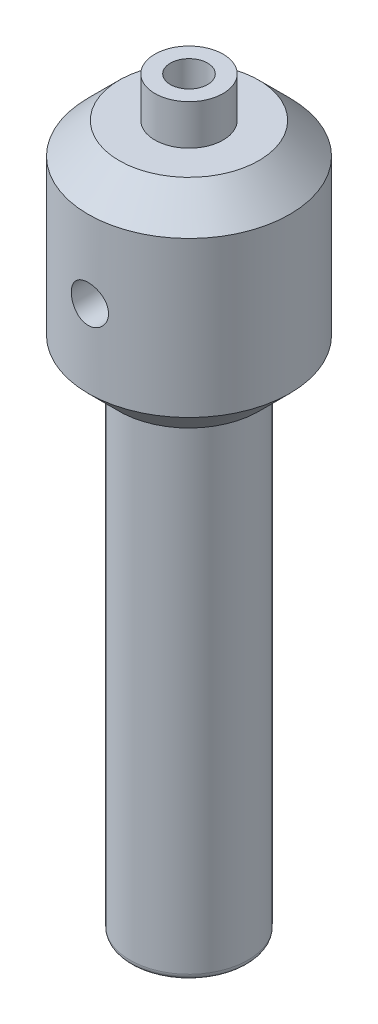
ISO-10303-21;
HEADER;
FILE_DESCRIPTION(('STEP AP214'),'2;1');
FILE_NAME('part.step','',(''),(''),'','','');
FILE_SCHEMA(('AUTOMOTIVE_DESIGN { 1 0 10303 214 1 1 1 1 }'));
ENDSEC;
DATA;
#1=APPLICATION_CONTEXT('core data for automotive mechanical design processes');
#2=APPLICATION_PROTOCOL_DEFINITION('international standard','automotive_design',2000,#1);
#3=PRODUCT_CONTEXT('',#1,'mechanical');
#4=PRODUCT('Part','Part','',(#3));
#5=PRODUCT_RELATED_PRODUCT_CATEGORY('part','',(#4));
#6=PRODUCT_DEFINITION_FORMATION('','',#4);
#7=PRODUCT_DEFINITION_CONTEXT('part definition',#1,'design');
#8=PRODUCT_DEFINITION('design','',#6,#7);
#9=PRODUCT_DEFINITION_SHAPE('','',#8);
#10=(LENGTH_UNIT() NAMED_UNIT(*) SI_UNIT(.MILLI.,.METRE.));
#11=(NAMED_UNIT(*) PLANE_ANGLE_UNIT() SI_UNIT($,.RADIAN.));
#12=(NAMED_UNIT(*) SI_UNIT($,.STERADIAN.) SOLID_ANGLE_UNIT());
#13=UNCERTAINTY_MEASURE_WITH_UNIT(LENGTH_MEASURE(1.E-05),#10,'distance_accuracy_value','');
#14=(GEOMETRIC_REPRESENTATION_CONTEXT(3) GLOBAL_UNCERTAINTY_ASSIGNED_CONTEXT((#13)) GLOBAL_UNIT_ASSIGNED_CONTEXT((#10,
#11,#12)) REPRESENTATION_CONTEXT('',''));
#15=CARTESIAN_POINT('',(0.,0.,0.));
#16=DIRECTION('',(0.,0.,1.));
#17=DIRECTION('',(1.,0.,0.));
#18=AXIS2_PLACEMENT_3D('',#15,#16,#17);
#19=CARTESIAN_POINT('',(19.,0.,0.));
#20=DIRECTION('',(0.,-1.,0.));
#21=DIRECTION('',(0.,0.,-1.));
#22=AXIS2_PLACEMENT_3D('',#19,#20,#21);
#23=PLANE('',#22);
#24=CARTESIAN_POINT('',(0.,0.,0.));
#25=DIRECTION('',(0.,-1.,0.));
#26=DIRECTION('',(0.,0.,-1.));
#27=AXIS2_PLACEMENT_3D('',#24,#25,#26);
#28=CIRCLE('',#27,17.);
#29=CARTESIAN_POINT('',(0.,0.,-17.));
#30=VERTEX_POINT('',#29);
#31=EDGE_CURVE('E68',#30,#30,#28,.T.);
#32=ORIENTED_EDGE('',*,*,#31,.T.);
#33=EDGE_LOOP('',(#32));
#34=FACE_BOUND('',#33,.T.);
#35=ADVANCED_FACE('F45',(#34),#23,.T.);
#36=CARTESIAN_POINT('',(0.,240.,0.));
#37=DIRECTION('',(0.,1.,0.));
#38=DIRECTION('',(0.,0.,1.));
#39=AXIS2_PLACEMENT_3D('',#36,#37,#38);
#40=PLANE('',#39);
#41=CARTESIAN_POINT('',(0.,240.,0.));
#42=DIRECTION('',(0.,1.,0.));
#43=DIRECTION('',(0.,0.,1.));
#44=AXIS2_PLACEMENT_3D('',#41,#42,#43);
#45=CIRCLE('',#44,6.00000000000001);
#46=CARTESIAN_POINT('',(0.,240.,6.00000000000001));
#47=VERTEX_POINT('',#46);
#48=EDGE_CURVE('E177',#47,#47,#45,.T.);
#49=ORIENTED_EDGE('',*,*,#48,.F.);
#50=EDGE_LOOP('',(#49));
#51=FACE_BOUND('',#50,.T.);
#52=CARTESIAN_POINT('',(0.,240.,0.));
#53=DIRECTION('',(0.,-1.,0.));
#54=DIRECTION('',(0.,0.,-1.));
#55=AXIS2_PLACEMENT_3D('',#52,#53,#54);
#56=CIRCLE('',#55,11.);
#57=CARTESIAN_POINT('',(0.,240.,-11.));
#58=VERTEX_POINT('',#57);
#59=EDGE_CURVE('E150',#58,#58,#56,.T.);
#60=ORIENTED_EDGE('',*,*,#59,.F.);
#61=EDGE_LOOP('',(#60));
#62=FACE_BOUND('',#61,.T.);
#63=ADVANCED_FACE('F108',(#51,#62),#40,.T.);
#64=CARTESIAN_POINT('',(0.,0.,0.));
#65=DIRECTION('',(0.,-1.,0.));
#66=DIRECTION('',(0.,0.,-1.));
#67=AXIS2_PLACEMENT_3D('',#64,#65,#66);
#68=CYLINDRICAL_SURFACE('',#67,11.);
#69=ORIENTED_EDGE('',*,*,#59,.T.);
#70=EDGE_LOOP('',(#69));
#71=FACE_BOUND('',#70,.T.);
#72=CARTESIAN_POINT('',(0.,227.,0.));
#73=DIRECTION('',(0.,-1.,0.));
#74=DIRECTION('',(0.,0.,-1.));
#75=AXIS2_PLACEMENT_3D('',#72,#73,#74);
#76=CIRCLE('',#75,11.);
#77=CARTESIAN_POINT('',(0.,227.,-11.));
#78=VERTEX_POINT('',#77);
#79=EDGE_CURVE('E162',#78,#78,#76,.T.);
#80=ORIENTED_EDGE('',*,*,#79,.F.);
#81=EDGE_LOOP('',(#80));
#82=FACE_BOUND('',#81,.T.);
#83=ADVANCED_FACE('F115',(#71,#82),#68,.T.);
#84=CARTESIAN_POINT('',(11.,227.,0.));
#85=DIRECTION('',(0.,1.,0.));
#86=DIRECTION('',(0.,0.,1.));
#87=AXIS2_PLACEMENT_3D('',#84,#85,#86);
#88=PLANE('',#87);
#89=CARTESIAN_POINT('',(0.,227.,0.));
#90=DIRECTION('',(0.,1.,0.));
#91=DIRECTION('',(0.,0.,1.));
#92=AXIS2_PLACEMENT_3D('',#89,#90,#91);
#93=CIRCLE('',#92,22.5);
#94=CARTESIAN_POINT('',(0.,227.,22.5));
#95=VERTEX_POINT('',#94);
#96=EDGE_CURVE('E137',#95,#95,#93,.T.);
#97=ORIENTED_EDGE('',*,*,#96,.T.);
#98=EDGE_LOOP('',(#97));
#99=FACE_BOUND('',#98,.T.);
#100=ORIENTED_EDGE('',*,*,#79,.T.);
#101=EDGE_LOOP('',(#100));
#102=FACE_BOUND('',#101,.T.);
#103=ADVANCED_FACE('F103',(#99,#102),#88,.T.);
#104=CARTESIAN_POINT('',(0.,0.,0.));
#105=DIRECTION('',(0.,-1.,0.));
#106=DIRECTION('',(0.,0.,-1.));
#107=AXIS2_PLACEMENT_3D('',#104,#105,#106);
#108=CYLINDRICAL_SURFACE('',#107,32.5);
#109=CARTESIAN_POINT('',(0.,198.,-32.5));
#110=CARTESIAN_POINT('',(0.167047387974413,198.000002951048,-32.5000014014323));
#111=CARTESIAN_POINT('',(0.334056414535263,197.993021813711,-32.498709777994));
#112=CARTESIAN_POINT('',(0.666922031200574,197.965157067144,-32.4935823968578));
#113=CARTESIAN_POINT('',(0.832778404858177,197.944270914476,-32.4897461737147));
#114=CARTESIAN_POINT('',(1.16218709311424,197.888738536972,-32.4796320956752));
#115=CARTESIAN_POINT('',(1.32573803450884,197.854084442608,-32.4733528444273));
#116=CARTESIAN_POINT('',(1.64934345668916,197.771271041131,-32.4585259988948));
#117=CARTESIAN_POINT('',(1.80939663010089,197.72310677428,-32.449977571632));
#118=CARTESIAN_POINT('',(2.12461909376536,197.613714664144,-32.4308633624607));
#119=CARTESIAN_POINT('',(2.27979434281073,197.552503531732,-32.4203001629443));
#120=CARTESIAN_POINT('',(2.58446206954015,197.417410303793,-32.3974366809218));
#121=CARTESIAN_POINT('',(2.73395242740515,197.34352353721,-32.3851357583491));
#122=CARTESIAN_POINT('',(3.0261060502108,197.1836663224,-32.3591437290318));
#123=CARTESIAN_POINT('',(3.16877249289801,197.097701573525,-32.3454532788177));
#124=CARTESIAN_POINT('',(3.44644953798865,196.914233178875,-32.3170461894859));
#125=CARTESIAN_POINT('',(3.5814572600222,196.816725233819,-32.302329168864));
#126=CARTESIAN_POINT('',(3.84417623264325,196.609831402662,-32.2721237443791));
#127=CARTESIAN_POINT('',(3.97180053780937,196.500336011848,-32.2566290755317));
#128=CARTESIAN_POINT('',(4.21744501771728,196.27099554245,-32.2254324395731));
#129=CARTESIAN_POINT('',(4.33546161754137,196.151146645324,-32.2097303978036));
#130=CARTESIAN_POINT('',(4.56100087376238,195.901986604755,-32.1785678807606));
#131=CARTESIAN_POINT('',(4.66852662807659,195.772678274512,-32.1631073353135));
#132=CARTESIAN_POINT('',(4.87241936155105,195.505394933914,-32.1328517105622));
#133=CARTESIAN_POINT('',(4.96878221059232,195.36741674477,-32.1180568787931));
#134=CARTESIAN_POINT('',(5.15028638072952,195.082734596099,-32.0894539852933));
#135=CARTESIAN_POINT('',(5.23534055334005,194.935974240216,-32.075653924559));
#136=CARTESIAN_POINT('',(5.39279796033513,194.635620840363,-32.0495569658406));
#137=CARTESIAN_POINT('',(5.46519645843932,194.482025265232,-32.0372606311283));
#138=CARTESIAN_POINT('',(5.59673049546194,194.169186629211,-32.0145447471987));
#139=CARTESIAN_POINT('',(5.65587180506682,194.00994606061,-32.004124381786));
#140=CARTESIAN_POINT('',(5.76049139817701,193.68689735635,-31.9854579827381));
#141=CARTESIAN_POINT('',(5.80596470935164,193.523087582069,-31.9772127405319));
#142=CARTESIAN_POINT('',(5.92036897645239,193.030409159429,-31.9563064605375));
#143=CARTESIAN_POINT('',(5.96891901071691,192.696386732529,-31.9471824578801));
#144=CARTESIAN_POINT('',(6.0093777303918,192.025005778692,-31.9395955731684));
#145=CARTESIAN_POINT('',(6.00129133836947,191.687647544233,-31.9411317645811));
#146=CARTESIAN_POINT('',(5.92929348899846,191.023490395548,-31.954573465592));
#147=CARTESIAN_POINT('',(5.86609521960248,190.696611688162,-31.9663464973695));
#148=CARTESIAN_POINT('',(5.68676990030916,190.058190702375,-31.9987323168554));
#149=CARTESIAN_POINT('',(5.57064066366295,189.746649058187,-32.0193454697756));
#150=CARTESIAN_POINT('',(5.28805391152012,189.145635615852,-32.0672268492818));
#151=CARTESIAN_POINT('',(5.12130716064853,188.856302952439,-32.0945331440214));
#152=CARTESIAN_POINT('',(4.74242193954202,188.30945617947,-32.1526990787034));
#153=CARTESIAN_POINT('',(4.53027899873099,188.051945207629,-32.1835590684723));
#154=CARTESIAN_POINT('',(4.0627715303044,187.571927527527,-32.2459333357088));
#155=CARTESIAN_POINT('',(3.80679653324243,187.350015311049,-32.2774504088927));
#156=CARTESIAN_POINT('',(3.26093695329239,186.952194045544,-32.3371543132372));
#157=CARTESIAN_POINT('',(2.97105204985807,186.776285431433,-32.3653411129122));
#158=CARTESIAN_POINT('',(2.36499021324981,186.475381996096,-32.4152628733546));
#159=CARTESIAN_POINT('',(2.04878258243285,186.350447651793,-32.4369901621846));
#160=CARTESIAN_POINT('',(1.39937919492224,186.155633070481,-32.4714852504939));
#161=CARTESIAN_POINT('',(1.06618519067571,186.085747166433,-32.4842539722107));
#162=CARTESIAN_POINT('',(0.397383215203499,186.003837604151,-32.4992669465579));
#163=CARTESIAN_POINT('',(0.0618782483745508,185.990999171889,-32.5016593853383));
#164=CARTESIAN_POINT('',(-0.606484909661271,186.021365382145,-32.4960590637379));
#165=CARTESIAN_POINT('',(-0.939343226021675,186.064567358601,-32.4880667973981));
#166=CARTESIAN_POINT('',(-1.59038992422883,186.205110554301,-32.4626872786007));
#167=CARTESIAN_POINT('',(-1.90867005010831,186.302040788101,-32.4453713741909));
#168=CARTESIAN_POINT('',(-2.52446187534885,186.546845306371,-32.4032781211012));
#169=CARTESIAN_POINT('',(-2.82197219688196,186.694722966739,-32.3785002779893));
#170=CARTESIAN_POINT('',(-3.39126548533968,187.039036730946,-32.3238620342217));
#171=CARTESIAN_POINT('',(-3.66274135122634,187.235972303467,-32.2939504055836));
#172=CARTESIAN_POINT('',(-4.16908432952836,187.672135346245,-32.2324977111764));
#173=CARTESIAN_POINT('',(-4.40394813141742,187.911366636785,-32.2009564984004));
#174=CARTESIAN_POINT('',(-4.83348551479758,188.429009489889,-32.1393095123828));
#175=CARTESIAN_POINT('',(-5.02760384169284,188.707885037177,-32.1092273941104));
#176=CARTESIAN_POINT('',(-5.3662384165949,189.29477862801,-32.0543763326783));
#177=CARTESIAN_POINT('',(-5.51075647264598,189.602795608759,-32.0296071958605));
#178=CARTESIAN_POINT('',(-5.74529998594316,190.237733868761,-31.9883683472532));
#179=CARTESIAN_POINT('',(-5.83558308225324,190.564557555855,-31.9718594593372));
#180=CARTESIAN_POINT('',(-5.9598710985257,191.229255527096,-31.948929495688));
#181=CARTESIAN_POINT('',(-5.9938821523063,191.567128602734,-31.9425073204774));
#182=CARTESIAN_POINT('',(-6.00189486714629,192.071678138939,-31.9409937887346));
#183=CARTESIAN_POINT('',(-5.99758283494899,192.238274119685,-31.9418077558083));
#184=CARTESIAN_POINT('',(-5.97513253775216,192.570482113081,-31.9460164877228));
#185=CARTESIAN_POINT('',(-5.95699949373229,192.736094473498,-31.949410278017));
#186=CARTESIAN_POINT('',(-5.9070336299794,193.065215620486,-31.9586855963114));
#187=CARTESIAN_POINT('',(-5.87519596756223,193.228723642411,-31.9645680036804));
#188=CARTESIAN_POINT('',(-5.79808429743152,193.552378272652,-31.9786453020169));
#189=CARTESIAN_POINT('',(-5.75281510317849,193.712526063197,-31.9868393645045));
#190=CARTESIAN_POINT('',(-5.6492524053349,194.028176622226,-32.00529184354));
#191=CARTESIAN_POINT('',(-5.59097742811479,194.183685644782,-32.0155473216154));
#192=CARTESIAN_POINT('',(-5.46182056358106,194.489178204963,-32.037833983043));
#193=CARTESIAN_POINT('',(-5.39094316290595,194.63916368618,-32.049864534186));
#194=CARTESIAN_POINT('',(-5.23704527717771,194.932717658784,-32.0753712303171));
#195=CARTESIAN_POINT('',(-5.154019883669,195.076283525534,-32.0888479590507));
#196=CARTESIAN_POINT('',(-4.97646002457541,195.35593046589,-32.1168634444832));
#197=CARTESIAN_POINT('',(-4.88192955508218,195.492014114611,-32.1314018317353));
#198=CARTESIAN_POINT('',(-4.68049098336986,195.757821711608,-32.1613669342853));
#199=CARTESIAN_POINT('',(-4.5734194828492,195.887420733857,-32.1768036560178));
#200=CARTESIAN_POINT('',(-4.34884138360292,196.137120438952,-32.2079248208257));
#201=CARTESIAN_POINT('',(-4.23133849380697,196.257224469299,-32.2236091742366));
#202=CARTESIAN_POINT('',(-3.98659111868759,196.487238515557,-32.2548029719053));
#203=CARTESIAN_POINT('',(-3.85934088957489,196.597142435201,-32.2703123067585));
#204=CARTESIAN_POINT('',(-3.59607102507716,196.805880120683,-32.3007093143118));
#205=CARTESIAN_POINT('',(-3.46005463969105,196.904717952427,-32.3155972140706));
#206=CARTESIAN_POINT('',(-3.17885786431139,197.091523494682,-32.3444742543554));
#207=CARTESIAN_POINT('',(-3.03360543194255,197.179384266206,-32.3584539984353));
#208=CARTESIAN_POINT('',(-2.73613292684859,197.342503362624,-32.3849635764459));
#209=CARTESIAN_POINT('',(-2.58391544613778,197.417766327943,-32.3974939437295));
#210=CARTESIAN_POINT('',(-2.27362825228651,197.555121589046,-32.4207463085122));
#211=CARTESIAN_POINT('',(-2.11556241225016,197.617222424426,-32.4314694775915));
#212=CARTESIAN_POINT('',(-1.7946722831985,197.727823393983,-32.4508090321666));
#213=CARTESIAN_POINT('',(-1.63184896912176,197.776326293468,-32.4594258459697));
#214=CARTESIAN_POINT('',(-1.22783758338942,197.878204607649,-32.4776798969894));
#215=CARTESIAN_POINT('',(-0.98458873619416,197.923819554013,-32.4860086220748));
#216=CARTESIAN_POINT('',(-0.49419856019614,197.984714702236,-32.4971675709575));
#217=CARTESIAN_POINT('',(-0.247057325390453,197.999995635502,-32.4999979273299));
#218=CARTESIAN_POINT('',(0.,198.,-32.5));
#219=B_SPLINE_CURVE_WITH_KNOTS('',3,(#109,#110,#111,#112,#113,#114,#115,#116,#117,#118,#119,
#120,#121,#122,#123,#124,#125,#126,#127,#128,#129,#130,#131,#132,#133,#134,#135,#136,#137,#138,
#139,#140,#141,#142,#143,#144,#145,#146,#147,#148,#149,#150,#151,#152,#153,#154,#155,#156,#157,
#158,#159,#160,#161,#162,#163,#164,#165,#166,#167,#168,#169,#170,#171,#172,#173,#174,#175,#176,
#177,#178,#179,#180,#181,#182,#183,#184,#185,#186,#187,#188,#189,#190,#191,#192,#193,#194,#195,
#196,#197,#198,#199,#200,#201,#202,#203,#204,#205,#206,#207,#208,#209,#210,#211,#212,#213,#214,
#215,#216,#217,#218),.UNSPECIFIED.,.T.,.F.,(4,2,2,2,2,2,2,2,2,2,2,2,2,2,2,2,2,2,2,2,2,2,2,2,2,2,
2,2,2,2,2,2,2,2,2,2,2,2,2,2,2,2,2,2,2,2,2,2,2,2,2,2,2,2,4),(0.,0.500925415856104,
1.00194248373588,1.50324633759921,2.00473446721871,2.50558409263794,3.00661868254916,
3.5074176336936,4.00840369848706,4.51442366052908,5.0206310543591,5.52668851124021,
6.03293260831374,6.54287614170782,7.05301011052265,7.56292159140477,8.07301835093452,
9.08064758459464,10.088189241028,11.0828828743722,12.0776176054417,13.0781469402784,
14.0787748517292,15.0946807664379,16.1105962851585,17.1277136264852,18.144726245551,
19.147165819545,20.1495577053301,21.1443857119725,22.1392796509597,23.1447493595254,
24.1503099317355,25.1687925873859,26.1872381130497,27.2008065243771,28.2142644464847,
28.7137382676778,29.2130235027488,29.7124853110036,30.2117683427893,30.7103446486533,
31.2087438085096,31.7073449079496,32.2057733184101,32.711626137455,33.2172998130326,
33.7232737924587,34.2290612523622,34.7394448349454,35.2496400010553,35.7595031320703,
36.2692625008281,37.0101317779487,37.7509831912043),.UNSPECIFIED.);
#220=CARTESIAN_POINT('',(0.,198.,-32.5));
#221=VERTEX_POINT('',#220);
#222=EDGE_CURVE('E10',#221,#221,#219,.T.);
#223=ORIENTED_EDGE('',*,*,#222,.F.);
#224=EDGE_LOOP('',(#223));
#225=FACE_BOUND('',#224,.T.);
#226=CARTESIAN_POINT('',(6.,192.,31.9413525073689));
#227=CARTESIAN_POINT('',(6.00000295853529,192.16702010578,31.9413510155267));
#228=CARTESIAN_POINT('',(5.99302407715925,192.334001842829,31.9426650102768));
#229=CARTESIAN_POINT('',(5.96516856930218,192.666812138617,31.9478791151134));
#230=CARTESIAN_POINT('',(5.94428939706713,192.832640480497,31.9517796989175));
#231=CARTESIAN_POINT('',(5.88877610738075,193.161992514205,31.9620573065449));
#232=CARTESIAN_POINT('',(5.85413407949498,193.325514824534,31.9684357545158));
#233=CARTESIAN_POINT('',(5.77135045100129,193.649062361184,31.9834845406126));
#234=CARTESIAN_POINT('',(5.72320388723112,193.80908627843,31.9921557212921));
#235=CARTESIAN_POINT('',(5.61385452206621,194.124246490147,32.0115246934934));
#236=CARTESIAN_POINT('',(5.55266878540924,194.279388871567,32.0222198341717));
#237=CARTESIAN_POINT('',(5.41763251250718,194.583993638257,32.0453420785026));
#238=CARTESIAN_POINT('',(5.34377730623473,194.733453904166,32.0577698204827));
#239=CARTESIAN_POINT('',(5.18398806674358,195.025552629714,32.0839962627161));
#240=CARTESIAN_POINT('',(5.09805970034272,195.168194247985,32.0977943188948));
#241=CARTESIAN_POINT('',(4.91466745622354,195.445828347411,32.1263856672193));
#242=CARTESIAN_POINT('',(4.81719927981947,195.580817950254,32.1411793293462));
#243=CARTESIAN_POINT('',(4.61034548396164,195.843560996205,32.1715052735179));
#244=CARTESIAN_POINT('',(4.5008459742891,195.971224083592,32.1870436584928));
#245=CARTESIAN_POINT('',(4.27148905640614,196.216946537089,32.2182832804323));
#246=CARTESIAN_POINT('',(4.15162782612187,196.335002327964,32.2339845755935));
#247=CARTESIAN_POINT('',(3.90243530466569,196.560618341113,32.2651012097673));
#248=CARTESIAN_POINT('',(3.77310687922168,196.668181716642,32.2805166335572));
#249=CARTESIAN_POINT('',(3.50577559302649,196.872146891922,32.3106427456993));
#250=CARTESIAN_POINT('',(3.36776955266252,196.968544563181,32.3253531722094));
#251=CARTESIAN_POINT('',(3.08306471017446,197.150088678451,32.3537527138723));
#252=CARTESIAN_POINT('',(2.93631162303767,197.235151271087,32.3674339230622));
#253=CARTESIAN_POINT('',(2.63597199364874,197.39262626248,32.3932768150281));
#254=CARTESIAN_POINT('',(2.4823829201994,197.465033925708,32.405437928495));
#255=CARTESIAN_POINT('',(2.16955749285646,197.596586679502,32.4278825976848));
#256=CARTESIAN_POINT('',(2.0103236129902,197.655737499093,32.4381669640968));
#257=CARTESIAN_POINT('',(1.68728985940888,197.760376316327,32.4565759252546));
#258=CARTESIAN_POINT('',(1.52348834648178,197.805859338139,32.4646997333147));
#259=CARTESIAN_POINT('',(1.0308533158068,197.920290031532,32.4852880303492));
#260=CARTESIAN_POINT('',(0.696870045496291,197.96886042554,32.4942588120656));
#261=CARTESIAN_POINT('',(0.0255664198837345,198.009373397857,32.5017263371873));
#262=CARTESIAN_POINT('',(-0.311753657266851,198.001320657124,32.5002239463955));
#263=CARTESIAN_POINT('',(-0.976054278284204,197.929377926863,32.4870176310848));
#264=CARTESIAN_POINT('',(-1.30311063675732,197.866167164928,32.4754378068713));
#265=CARTESIAN_POINT('',(-1.94188038235149,197.686755984159,32.4435119174271));
#266=CARTESIAN_POINT('',(-2.25359322258673,197.570553678071,32.4231655399838));
#267=CARTESIAN_POINT('',(-2.85482127182886,197.287811975478,32.3757858792464));
#268=CARTESIAN_POINT('',(-3.14420524520471,197.12099977746,32.3487165042421));
#269=CARTESIAN_POINT('',(-3.69112726413706,196.741972872398,32.2908861364092));
#270=CARTESIAN_POINT('',(-3.94866216241414,196.529753683949,32.2601247793352));
#271=CARTESIAN_POINT('',(-4.42860067861483,196.062189714966,32.1977799600072));
#272=CARTESIAN_POINT('',(-4.65042497033574,195.806250600413,32.1661910748591));
#273=CARTESIAN_POINT('',(-5.04808559706014,195.260494957064,32.1061894073334));
#274=CARTESIAN_POINT('',(-5.22392129912474,194.970677962086,32.077776668672));
#275=CARTESIAN_POINT('',(-5.52477115699434,194.364639341077,32.0273370970672));
#276=CARTESIAN_POINT('',(-5.64970322536738,194.048376049523,32.0053205950001));
#277=CARTESIAN_POINT('',(-5.84449643174312,193.398850988088,31.9703261346543));
#278=CARTESIAN_POINT('',(-5.9143636046489,193.065591085235,31.9573471859124));
#279=CARTESIAN_POINT('',(-5.99620229168364,192.396751015839,31.9420927158331));
#280=CARTESIAN_POINT('',(-6.00900518397556,192.061275977497,31.9396635072359));
#281=CARTESIAN_POINT('',(-5.97857858316261,191.392981018201,31.9453725765504));
#282=CARTESIAN_POINT('',(-5.93535177193745,191.060160970932,31.9535103486703));
#283=CARTESIAN_POINT('',(-5.79480586142508,190.409343291511,31.979293465026));
#284=CARTESIAN_POINT('',(-5.69792075735498,190.091248642484,31.9968624934417));
#285=CARTESIAN_POINT('',(-5.45326809850267,189.475807966959,32.0394630353324));
#286=CARTESIAN_POINT('',(-5.30549689375587,189.178463430668,32.0644950840986));
#287=CARTESIAN_POINT('',(-4.96134651750513,188.609295414165,32.1195522144905));
#288=CARTESIAN_POINT('',(-4.76444105467972,188.337795366043,32.1496301190139));
#289=CARTESIAN_POINT('',(-4.32832188526401,187.831389726128,32.2112404635557));
#290=CARTESIAN_POINT('',(-4.08910449593802,187.596487323062,32.2427730300079));
#291=CARTESIAN_POINT('',(-3.57144762775753,187.166848798412,32.3042327039952));
#292=CARTESIAN_POINT('',(-3.29254111714155,186.972671136173,32.3341337897011));
#293=CARTESIAN_POINT('',(-2.70556807005943,186.633932586305,32.3885259688708));
#294=CARTESIAN_POINT('',(-2.39750263248844,186.489369829818,32.4130172660943));
#295=CARTESIAN_POINT('',(-1.7625807268193,186.254800177585,32.453720812997));
#296=CARTESIAN_POINT('',(-1.43582908021701,186.164516450471,32.4699750052543));
#297=CARTESIAN_POINT('',(-0.771284675971643,186.040202759824,32.4925422562138));
#298=CARTESIAN_POINT('',(-0.433493046619092,186.00616706594,32.4988563275773));
#299=CARTESIAN_POINT('',(0.0710321096354791,185.998095984879,32.5003540565631));
#300=CARTESIAN_POINT('',(0.237682638844517,186.002392189745,32.499557269084));
#301=CARTESIAN_POINT('',(0.570001473574026,186.024820064111,32.495424432952));
#302=CARTESIAN_POINT('',(0.735670126050057,186.042946511486,32.4920893427311));
#303=CARTESIAN_POINT('',(1.06490505616126,186.092908806817,32.4829668638015));
#304=CARTESIAN_POINT('',(1.22847057559065,186.124749463685,32.4771786148997));
#305=CARTESIAN_POINT('',(1.55224085017753,186.201877246057,32.4633144843585));
#306=CARTESIAN_POINT('',(1.71244678909536,186.247159547125,32.4552394235426));
#307=CARTESIAN_POINT('',(2.02822736208988,186.350763583394,32.4370355937856));
#308=CARTESIAN_POINT('',(2.18380784113108,186.409067993915,32.4269095551274));
#309=CARTESIAN_POINT('',(2.48943892302124,186.538295909441,32.4048786716608));
#310=CARTESIAN_POINT('',(2.63949147339193,186.609214917922,32.3929744609303));
#311=CARTESIAN_POINT('',(2.9331721059094,186.763206776707,32.3677035827214));
#312=CARTESIAN_POINT('',(3.07679757825834,186.846284506776,32.3543363286126));
#313=CARTESIAN_POINT('',(3.35655401432149,187.02395797939,32.326510815552));
#314=CARTESIAN_POINT('',(3.49268756010242,187.118549717111,32.3120529366048));
#315=CARTESIAN_POINT('',(3.75850222746005,187.32005643899,32.2822211930687));
#316=CARTESIAN_POINT('',(3.88806348648543,187.427128074562,32.2668371982911));
#317=CARTESIAN_POINT('',(4.13768673508277,187.651698606635,32.2357777361536));
#318=CARTESIAN_POINT('',(4.2577520724429,187.769193797036,32.2201023739441));
#319=CARTESIAN_POINT('',(4.48768949162613,188.013917992755,32.188881874074));
#320=CARTESIAN_POINT('',(4.59755543208625,188.141152779532,32.1733368199345));
#321=CARTESIAN_POINT('',(4.8062192058397,188.40438395591,32.1428277311297));
#322=CARTESIAN_POINT('',(4.9050210981696,188.540377103324,32.1278634847102));
#323=CARTESIAN_POINT('',(5.09178042683273,188.821553772614,32.0987973355248));
#324=CARTESIAN_POINT('',(5.1796281571812,188.966811164144,32.084704774444));
#325=CARTESIAN_POINT('',(5.34272083193665,189.264291908901,32.0579500798171));
#326=CARTESIAN_POINT('',(5.4179704171096,189.416512670611,32.0452874201016));
#327=CARTESIAN_POINT('',(5.55529909721155,189.726805727056,32.0217661734497));
#328=CARTESIAN_POINT('',(5.61738677931814,189.884874127068,32.010906411264));
#329=CARTESIAN_POINT('',(5.72796202752485,190.205770370251,31.9913049603575));
#330=CARTESIAN_POINT('',(5.7764523672906,190.36859723527,31.9825628397174));
#331=CARTESIAN_POINT('',(5.87827970156251,190.772538416944,31.964037017176));
#332=CARTESIAN_POINT('',(5.92386631533029,191.015711803916,31.9555746068072));
#333=CARTESIAN_POINT('',(5.9847238866214,191.505951494842,31.9442335268558));
#334=CARTESIAN_POINT('',(5.99999562504256,191.753017698353,31.9413547134423));
#335=CARTESIAN_POINT('',(6.,192.,31.9413525073689));
#336=B_SPLINE_CURVE_WITH_KNOTS('',3,(#226,#227,#228,#229,#230,#231,#232,#233,#234,#235,#236,
#237,#238,#239,#240,#241,#242,#243,#244,#245,#246,#247,#248,#249,#250,#251,#252,#253,#254,#255,
#256,#257,#258,#259,#260,#261,#262,#263,#264,#265,#266,#267,#268,#269,#270,#271,#272,#273,#274,
#275,#276,#277,#278,#279,#280,#281,#282,#283,#284,#285,#286,#287,#288,#289,#290,#291,#292,#293,
#294,#295,#296,#297,#298,#299,#300,#301,#302,#303,#304,#305,#306,#307,#308,#309,#310,#311,#312,
#313,#314,#315,#316,#317,#318,#319,#320,#321,#322,#323,#324,#325,#326,#327,#328,#329,#330,#331,
#332,#333,#334,#335),.UNSPECIFIED.,.T.,.F.,(4,2,2,2,2,2,2,2,2,2,2,2,2,2,2,2,2,2,2,2,2,2,2,2,2,2,
2,2,2,2,2,2,2,2,2,2,2,2,2,2,2,2,2,2,2,2,2,2,2,2,2,2,2,2,4),(0.,0.500843463331355,
1.00177867835027,1.50300223188229,2.00441023608585,2.50516601956038,3.00610678220385,
3.50681319732148,4.00770672054381,4.51383441416539,5.02014960364327,5.52631215984353,
6.03266127501115,6.54256967053901,7.05266846938638,7.56254639910265,8.07260972824404,
9.08012563787736,10.087558258518,11.082757472296,12.0779921321037,13.0786896815496,
14.0794860395937,15.0951637423725,16.1108554231421,17.128178591491,18.1453902495802,
19.1477325069965,20.1500267887514,21.144330335666,22.1387052169704,23.1442262843942,
24.1498349132333,25.1684425209453,26.1870117562707,27.2003410634462,28.2135671298398,
28.7132031034217,29.2126505140953,29.7122731996682,30.2117167784932,30.7104998117236,
31.2091054067347,31.7079116630686,32.2065449168668,32.7122968113089,33.217869600612,
33.7237448623406,34.2294339227625,34.7398381371698,35.2500539188164,35.7599357905254,
36.269713577754,37.010358887058,37.7509851174175),.UNSPECIFIED.);
#337=CARTESIAN_POINT('',(6.,192.,31.9413525073689));
#338=VERTEX_POINT('',#337);
#339=EDGE_CURVE('E58',#338,#338,#336,.T.);
#340=ORIENTED_EDGE('',*,*,#339,.F.);
#341=EDGE_LOOP('',(#340));
#342=FACE_BOUND('',#341,.T.);
#343=CARTESIAN_POINT('',(0.,167.,0.));
#344=DIRECTION('',(0.,-1.,0.));
#345=DIRECTION('',(0.,0.,-1.));
#346=AXIS2_PLACEMENT_3D('',#343,#344,#345);
#347=CIRCLE('',#346,32.5);
#348=CARTESIAN_POINT('',(0.,167.,-32.5));
#349=VERTEX_POINT('',#348);
#350=EDGE_CURVE('E143',#349,#349,#347,.F.);
#351=ORIENTED_EDGE('',*,*,#350,.T.);
#352=EDGE_LOOP('',(#351));
#353=FACE_BOUND('',#352,.T.);
#354=CARTESIAN_POINT('',(0.,217.,0.));
#355=DIRECTION('',(0.,1.,0.));
#356=DIRECTION('',(0.,0.,1.));
#357=AXIS2_PLACEMENT_3D('',#354,#355,#356);
#358=CIRCLE('',#357,32.5);
#359=CARTESIAN_POINT('',(0.,217.,32.5));
#360=VERTEX_POINT('',#359);
#361=EDGE_CURVE('E140',#360,#360,#358,.F.);
#362=ORIENTED_EDGE('',*,*,#361,.T.);
#363=EDGE_LOOP('',(#362));
#364=FACE_BOUND('',#363,.T.);
#365=ADVANCED_FACE('F74',(#225,#342,#353,#364),#108,.T.);
#366=CARTESIAN_POINT('',(32.5,157.,0.));
#367=DIRECTION('',(0.,-1.,0.));
#368=DIRECTION('',(0.,0.,-1.));
#369=AXIS2_PLACEMENT_3D('',#366,#367,#368);
#370=PLANE('',#369);
#371=CARTESIAN_POINT('',(0.,157.,0.));
#372=DIRECTION('',(0.,-1.,0.));
#373=DIRECTION('',(0.,0.,-1.));
#374=AXIS2_PLACEMENT_3D('',#371,#372,#373);
#375=CIRCLE('',#374,22.5);
#376=CARTESIAN_POINT('',(0.,157.,-22.5));
#377=VERTEX_POINT('',#376);
#378=EDGE_CURVE('E144',#377,#377,#375,.T.);
#379=ORIENTED_EDGE('',*,*,#378,.T.);
#380=EDGE_LOOP('',(#379));
#381=FACE_BOUND('',#380,.T.);
#382=CARTESIAN_POINT('',(0.,157.,0.));
#383=DIRECTION('',(0.,-1.,0.));
#384=DIRECTION('',(0.,0.,-1.));
#385=AXIS2_PLACEMENT_3D('',#382,#383,#384);
#386=CIRCLE('',#385,19.);
#387=CARTESIAN_POINT('',(0.,157.,-19.));
#388=VERTEX_POINT('',#387);
#389=EDGE_CURVE('E165',#388,#388,#386,.T.);
#390=ORIENTED_EDGE('',*,*,#389,.F.);
#391=EDGE_LOOP('',(#390));
#392=FACE_BOUND('',#391,.T.);
#393=ADVANCED_FACE('F94',(#381,#392),#370,.T.);
#394=CARTESIAN_POINT('',(0.,0.,0.));
#395=DIRECTION('',(0.,-1.,0.));
#396=DIRECTION('',(0.,0.,-1.));
#397=AXIS2_PLACEMENT_3D('',#394,#395,#396);
#398=CYLINDRICAL_SURFACE('',#397,19.);
#399=CARTESIAN_POINT('',(0.,2.,0.));
#400=DIRECTION('',(0.,-1.,0.));
#401=DIRECTION('',(0.,0.,-1.));
#402=AXIS2_PLACEMENT_3D('',#399,#400,#401);
#403=CIRCLE('',#402,19.);
#404=CARTESIAN_POINT('',(0.,2.,-19.));
#405=VERTEX_POINT('',#404);
#406=EDGE_CURVE('E63',#405,#405,#403,.F.);
#407=ORIENTED_EDGE('',*,*,#406,.T.);
#408=EDGE_LOOP('',(#407));
#409=FACE_BOUND('',#408,.T.);
#410=ORIENTED_EDGE('',*,*,#389,.T.);
#411=EDGE_LOOP('',(#410));
#412=FACE_BOUND('',#411,.T.);
#413=ADVANCED_FACE('F91',(#409,#412),#398,.T.);
#414=CARTESIAN_POINT('',(0.,157.,0.));
#415=DIRECTION('',(0.,1.,0.));
#416=DIRECTION('',(0.,0.,1.));
#417=AXIS2_PLACEMENT_3D('',#414,#415,#416);
#418=CONICAL_SURFACE('',#417,22.5,0.785398163397447);
#419=ORIENTED_EDGE('',*,*,#350,.F.);
#420=EDGE_LOOP('',(#419));
#421=FACE_BOUND('',#420,.T.);
#422=ORIENTED_EDGE('',*,*,#378,.F.);
#423=EDGE_LOOP('',(#422));
#424=FACE_BOUND('',#423,.T.);
#425=ADVANCED_FACE('F93',(#421,#424),#418,.T.);
#426=CARTESIAN_POINT('',(0.,217.,0.));
#427=DIRECTION('',(0.,-1.,0.));
#428=DIRECTION('',(0.,0.,-1.));
#429=AXIS2_PLACEMENT_3D('',#426,#427,#428);
#430=CONICAL_SURFACE('',#429,32.5,0.785398163397449);
#431=ORIENTED_EDGE('',*,*,#96,.F.);
#432=EDGE_LOOP('',(#431));
#433=FACE_BOUND('',#432,.T.);
#434=ORIENTED_EDGE('',*,*,#361,.F.);
#435=EDGE_LOOP('',(#434));
#436=FACE_BOUND('',#435,.T.);
#437=ADVANCED_FACE('F125',(#433,#436),#430,.T.);
#438=CARTESIAN_POINT('',(0.,2.,0.));
#439=DIRECTION('',(0.,-1.,0.));
#440=DIRECTION('',(0.,0.,-1.));
#441=AXIS2_PLACEMENT_3D('',#438,#439,#440);
#442=TOROIDAL_SURFACE('',#441,17.,2.);
#443=ORIENTED_EDGE('',*,*,#406,.F.);
#444=EDGE_LOOP('',(#443));
#445=FACE_BOUND('',#444,.T.);
#446=ORIENTED_EDGE('',*,*,#31,.F.);
#447=EDGE_LOOP('',(#446));
#448=FACE_BOUND('',#447,.T.);
#449=ADVANCED_FACE('F47',(#445,#448),#442,.T.);
#450=CARTESIAN_POINT('',(0.,217.,0.));
#451=DIRECTION('',(0.,-1.,0.));
#452=DIRECTION('',(0.,0.,-1.));
#453=AXIS2_PLACEMENT_3D('',#450,#451,#452);
#454=PLANE('',#453);
#455=CARTESIAN_POINT('',(0.,217.,0.));
#456=DIRECTION('',(0.,1.,0.));
#457=DIRECTION('',(0.,0.,1.));
#458=AXIS2_PLACEMENT_3D('',#455,#456,#457);
#459=CIRCLE('',#458,6.00000000000001);
#460=CARTESIAN_POINT('',(0.,217.,6.00000000000001));
#461=VERTEX_POINT('',#460);
#462=EDGE_CURVE('E171',#461,#461,#459,.T.);
#463=ORIENTED_EDGE('',*,*,#462,.T.);
#464=EDGE_LOOP('',(#463));
#465=FACE_BOUND('',#464,.T.);
#466=ADVANCED_FACE('F86',(#465),#454,.F.);
#467=CARTESIAN_POINT('',(0.,240.,0.));
#468=DIRECTION('',(0.,1.,0.));
#469=DIRECTION('',(0.,0.,1.));
#470=AXIS2_PLACEMENT_3D('',#467,#468,#469);
#471=CYLINDRICAL_SURFACE('',#470,6.00000000000001);
#472=ORIENTED_EDGE('',*,*,#462,.F.);
#473=EDGE_LOOP('',(#472));
#474=FACE_BOUND('',#473,.T.);
#475=ORIENTED_EDGE('',*,*,#48,.T.);
#476=EDGE_LOOP('',(#475));
#477=FACE_BOUND('',#476,.T.);
#478=ADVANCED_FACE('F82',(#474,#477),#471,.F.);
#479=CARTESIAN_POINT('',(0.,192.,-32.5));
#480=DIRECTION('',(0.,0.,1.));
#481=DIRECTION('',(1.,0.,0.));
#482=AXIS2_PLACEMENT_3D('',#479,#480,#481);
#483=CYLINDRICAL_SURFACE('',#482,6.);
#484=ORIENTED_EDGE('',*,*,#222,.T.);
#485=EDGE_LOOP('',(#484));
#486=FACE_BOUND('',#485,.T.);
#487=ORIENTED_EDGE('',*,*,#339,.T.);
#488=EDGE_LOOP('',(#487));
#489=FACE_BOUND('',#488,.T.);
#490=ADVANCED_FACE('F78',(#486,#489),#483,.F.);
#491=CLOSED_SHELL('',(#35,#63,#83,#103,#365,#393,#413,#425,#437,#449,#466,#478,#490));
#492=MANIFOLD_SOLID_BREP('B2',#491);
#493=ADVANCED_BREP_SHAPE_REPRESENTATION('',(#18,#492),#14);
#494=SHAPE_DEFINITION_REPRESENTATION(#9,#493);
ENDSEC;
END-ISO-10303-21;
